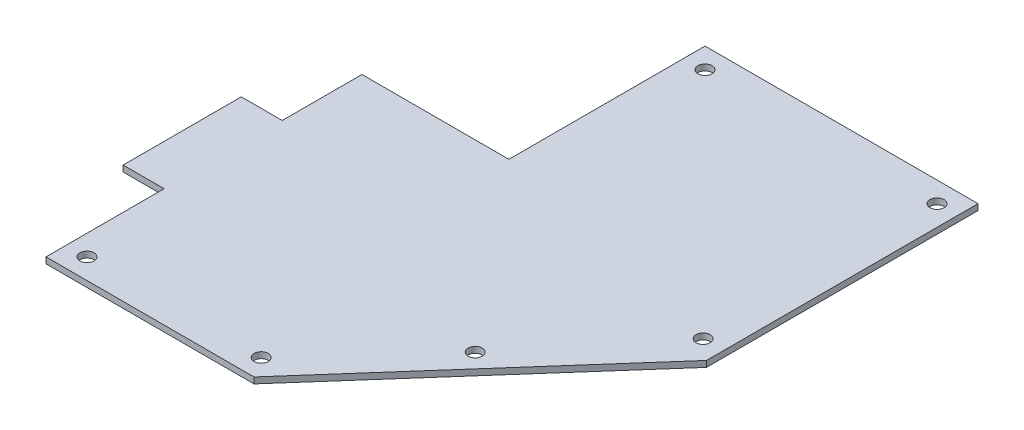
ISO-10303-21;
HEADER;
FILE_DESCRIPTION(('STEP AP214'),'2;1');
FILE_NAME('part.step','',(''),(''),'','','');
FILE_SCHEMA(('AUTOMOTIVE_DESIGN { 1 0 10303 214 1 1 1 1 }'));
ENDSEC;
DATA;
#1=APPLICATION_CONTEXT('core data for automotive mechanical design processes');
#2=APPLICATION_PROTOCOL_DEFINITION('international standard','automotive_design',2000,#1);
#3=PRODUCT_CONTEXT('',#1,'mechanical');
#4=PRODUCT('Part','Part','',(#3));
#5=PRODUCT_RELATED_PRODUCT_CATEGORY('part','',(#4));
#6=PRODUCT_DEFINITION_FORMATION('','',#4);
#7=PRODUCT_DEFINITION_CONTEXT('part definition',#1,'design');
#8=PRODUCT_DEFINITION('design','',#6,#7);
#9=PRODUCT_DEFINITION_SHAPE('','',#8);
#10=(LENGTH_UNIT() NAMED_UNIT(*) SI_UNIT(.MILLI.,.METRE.));
#11=(NAMED_UNIT(*) PLANE_ANGLE_UNIT() SI_UNIT($,.RADIAN.));
#12=(NAMED_UNIT(*) SI_UNIT($,.STERADIAN.) SOLID_ANGLE_UNIT());
#13=UNCERTAINTY_MEASURE_WITH_UNIT(LENGTH_MEASURE(1.E-05),#10,'distance_accuracy_value','');
#14=(GEOMETRIC_REPRESENTATION_CONTEXT(3) GLOBAL_UNCERTAINTY_ASSIGNED_CONTEXT((#13)) GLOBAL_UNIT_ASSIGNED_CONTEXT((#10,
#11,#12)) REPRESENTATION_CONTEXT('',''));
#15=CARTESIAN_POINT('',(0.,0.,0.));
#16=DIRECTION('',(0.,0.,1.));
#17=DIRECTION('',(1.,0.,0.));
#18=AXIS2_PLACEMENT_3D('',#15,#16,#17);
#19=CARTESIAN_POINT('',(0.,1.5,0.));
#20=DIRECTION('',(-1.,0.,0.));
#21=DIRECTION('',(0.,0.,1.));
#22=AXIS2_PLACEMENT_3D('',#19,#20,#21);
#23=PLANE('',#22);
#24=DIRECTION('',(0.,0.,-1.));
#25=VECTOR('',#24,1.);
#26=CARTESIAN_POINT('',(0.,0.,0.));
#27=LINE('',#26,#25);
#28=CARTESIAN_POINT('',(0.,0.,67.34));
#29=VERTEX_POINT('',#28);
#30=CARTESIAN_POINT('',(0.,0.,0.));
#31=VERTEX_POINT('',#30);
#32=EDGE_CURVE('E150',#29,#31,#27,.T.);
#33=ORIENTED_EDGE('',*,*,#32,.T.);
#34=DIRECTION('',(0.,-1.,0.));
#35=VECTOR('',#34,1.);
#36=CARTESIAN_POINT('',(0.,1.5,0.));
#37=LINE('',#36,#35);
#38=CARTESIAN_POINT('',(0.,1.5,0.));
#39=VERTEX_POINT('',#38);
#40=EDGE_CURVE('E11',#39,#31,#37,.T.);
#41=ORIENTED_EDGE('',*,*,#40,.F.);
#42=DIRECTION('',(0.,0.,-1.));
#43=VECTOR('',#42,1.);
#44=CARTESIAN_POINT('',(0.,1.5,0.));
#45=LINE('',#44,#43);
#46=CARTESIAN_POINT('',(0.,1.5,67.34));
#47=VERTEX_POINT('',#46);
#48=EDGE_CURVE('E171',#47,#39,#45,.T.);
#49=ORIENTED_EDGE('',*,*,#48,.F.);
#50=DIRECTION('',(0.,-1.,0.));
#51=VECTOR('',#50,1.);
#52=CARTESIAN_POINT('',(0.,1.5,67.34));
#53=LINE('',#52,#51);
#54=EDGE_CURVE('E146',#47,#29,#53,.T.);
#55=ORIENTED_EDGE('',*,*,#54,.T.);
#56=EDGE_LOOP('',(#33,#41,#49,#55));
#57=FACE_BOUND('',#56,.T.);
#58=ADVANCED_FACE('F36',(#57),#23,.F.);
#59=CARTESIAN_POINT('',(0.,1.5,0.));
#60=DIRECTION('',(0.,0.,1.));
#61=DIRECTION('',(1.,0.,0.));
#62=AXIS2_PLACEMENT_3D('',#59,#60,#61);
#63=PLANE('',#62);
#64=DIRECTION('',(-1.,0.,0.));
#65=VECTOR('',#64,1.);
#66=CARTESIAN_POINT('',(0.,0.,0.));
#67=LINE('',#66,#65);
#68=CARTESIAN_POINT('',(-67.7,0.,0.));
#69=VERTEX_POINT('',#68);
#70=EDGE_CURVE('E153',#31,#69,#67,.T.);
#71=ORIENTED_EDGE('',*,*,#70,.T.);
#72=DIRECTION('',(0.,-1.,0.));
#73=VECTOR('',#72,1.);
#74=CARTESIAN_POINT('',(-67.7,1.5,0.));
#75=LINE('',#74,#73);
#76=CARTESIAN_POINT('',(-67.7,1.5,0.));
#77=VERTEX_POINT('',#76);
#78=EDGE_CURVE('E44',#77,#69,#75,.T.);
#79=ORIENTED_EDGE('',*,*,#78,.F.);
#80=DIRECTION('',(-1.,0.,0.));
#81=VECTOR('',#80,1.);
#82=CARTESIAN_POINT('',(0.,1.5,0.));
#83=LINE('',#82,#81);
#84=EDGE_CURVE('E104',#39,#77,#83,.T.);
#85=ORIENTED_EDGE('',*,*,#84,.F.);
#86=ORIENTED_EDGE('',*,*,#40,.T.);
#87=EDGE_LOOP('',(#71,#79,#85,#86));
#88=FACE_BOUND('',#87,.T.);
#89=ADVANCED_FACE('F244',(#88),#63,.F.);
#90=CARTESIAN_POINT('',(-67.7,1.5,0.));
#91=DIRECTION('',(1.,0.,0.));
#92=DIRECTION('',(0.,0.,-1.));
#93=AXIS2_PLACEMENT_3D('',#90,#91,#92);
#94=PLANE('',#93);
#95=DIRECTION('',(0.,0.,1.));
#96=VECTOR('',#95,1.);
#97=CARTESIAN_POINT('',(-67.7,0.,0.));
#98=LINE('',#97,#96);
#99=CARTESIAN_POINT('',(-67.7,0.,48.64));
#100=VERTEX_POINT('',#99);
#101=EDGE_CURVE('E156',#69,#100,#98,.T.);
#102=ORIENTED_EDGE('',*,*,#101,.T.);
#103=DIRECTION('',(0.,-1.,0.));
#104=VECTOR('',#103,1.);
#105=CARTESIAN_POINT('',(-67.7,1.5,48.64));
#106=LINE('',#105,#104);
#107=CARTESIAN_POINT('',(-67.7,1.5,48.64));
#108=VERTEX_POINT('',#107);
#109=EDGE_CURVE('E187',#108,#100,#106,.T.);
#110=ORIENTED_EDGE('',*,*,#109,.F.);
#111=DIRECTION('',(0.,0.,1.));
#112=VECTOR('',#111,1.);
#113=CARTESIAN_POINT('',(-67.7,1.5,0.));
#114=LINE('',#113,#112);
#115=EDGE_CURVE('E195',#77,#108,#114,.T.);
#116=ORIENTED_EDGE('',*,*,#115,.F.);
#117=ORIENTED_EDGE('',*,*,#78,.T.);
#118=EDGE_LOOP('',(#102,#110,#116,#117));
#119=FACE_BOUND('',#118,.T.);
#120=ADVANCED_FACE('F193',(#119),#94,.F.);
#121=CARTESIAN_POINT('',(-67.7,1.5,48.64));
#122=DIRECTION('',(0.,0.,1.));
#123=DIRECTION('',(1.,0.,0.));
#124=AXIS2_PLACEMENT_3D('',#121,#122,#123);
#125=PLANE('',#124);
#126=DIRECTION('',(-1.,0.,0.));
#127=VECTOR('',#126,1.);
#128=CARTESIAN_POINT('',(-67.7,0.,48.64));
#129=LINE('',#128,#127);
#130=CARTESIAN_POINT('',(-104.14,0.,48.64));
#131=VERTEX_POINT('',#130);
#132=EDGE_CURVE('E158',#100,#131,#129,.T.);
#133=ORIENTED_EDGE('',*,*,#132,.T.);
#134=DIRECTION('',(0.,-1.,0.));
#135=VECTOR('',#134,1.);
#136=CARTESIAN_POINT('',(-104.14,1.5,48.64));
#137=LINE('',#136,#135);
#138=CARTESIAN_POINT('',(-104.14,1.5,48.64));
#139=VERTEX_POINT('',#138);
#140=EDGE_CURVE('E184',#139,#131,#137,.T.);
#141=ORIENTED_EDGE('',*,*,#140,.F.);
#142=DIRECTION('',(-1.,0.,0.));
#143=VECTOR('',#142,1.);
#144=CARTESIAN_POINT('',(-67.7,1.5,48.64));
#145=LINE('',#144,#143);
#146=EDGE_CURVE('E213',#108,#139,#145,.T.);
#147=ORIENTED_EDGE('',*,*,#146,.F.);
#148=ORIENTED_EDGE('',*,*,#109,.T.);
#149=EDGE_LOOP('',(#133,#141,#147,#148));
#150=FACE_BOUND('',#149,.T.);
#151=ADVANCED_FACE('F204',(#150),#125,.F.);
#152=CARTESIAN_POINT('',(-104.14,1.5,48.64));
#153=DIRECTION('',(1.,0.,0.));
#154=DIRECTION('',(0.,0.,-1.));
#155=AXIS2_PLACEMENT_3D('',#152,#153,#154);
#156=PLANE('',#155);
#157=DIRECTION('',(0.,0.,1.));
#158=VECTOR('',#157,1.);
#159=CARTESIAN_POINT('',(-104.14,0.,48.64));
#160=LINE('',#159,#158);
#161=CARTESIAN_POINT('',(-104.14,0.,68.4096817113205));
#162=VERTEX_POINT('',#161);
#163=EDGE_CURVE('E160',#131,#162,#160,.T.);
#164=ORIENTED_EDGE('',*,*,#163,.T.);
#165=DIRECTION('',(0.,-1.,0.));
#166=VECTOR('',#165,1.);
#167=CARTESIAN_POINT('',(-104.14,1.5,68.4096817113205));
#168=LINE('',#167,#166);
#169=CARTESIAN_POINT('',(-104.14,1.5,68.4096817113205));
#170=VERTEX_POINT('',#169);
#171=EDGE_CURVE('E181',#170,#162,#168,.T.);
#172=ORIENTED_EDGE('',*,*,#171,.F.);
#173=DIRECTION('',(0.,0.,1.));
#174=VECTOR('',#173,1.);
#175=CARTESIAN_POINT('',(-104.14,1.5,48.64));
#176=LINE('',#175,#174);
#177=EDGE_CURVE('E210',#139,#170,#176,.T.);
#178=ORIENTED_EDGE('',*,*,#177,.F.);
#179=ORIENTED_EDGE('',*,*,#140,.T.);
#180=EDGE_LOOP('',(#164,#172,#178,#179));
#181=FACE_BOUND('',#180,.T.);
#182=ADVANCED_FACE('F208',(#181),#156,.F.);
#183=CARTESIAN_POINT('',(-104.14,1.5,68.4096817113205));
#184=DIRECTION('',(0.,0.,1.));
#185=DIRECTION('',(1.,0.,0.));
#186=AXIS2_PLACEMENT_3D('',#183,#184,#185);
#187=PLANE('',#186);
#188=DIRECTION('',(-1.,0.,0.));
#189=VECTOR('',#188,1.);
#190=CARTESIAN_POINT('',(-104.14,0.,68.4096817113205));
#191=LINE('',#190,#189);
#192=CARTESIAN_POINT('',(-114.3,0.,68.4096817113205));
#193=VERTEX_POINT('',#192);
#194=EDGE_CURVE('E162',#162,#193,#191,.T.);
#195=ORIENTED_EDGE('',*,*,#194,.T.);
#196=DIRECTION('',(0.,-1.,0.));
#197=VECTOR('',#196,1.);
#198=CARTESIAN_POINT('',(-114.3,1.5,68.4096817113205));
#199=LINE('',#198,#197);
#200=CARTESIAN_POINT('',(-114.3,1.5,68.4096817113205));
#201=VERTEX_POINT('',#200);
#202=EDGE_CURVE('E178',#201,#193,#199,.T.);
#203=ORIENTED_EDGE('',*,*,#202,.F.);
#204=DIRECTION('',(-1.,0.,0.));
#205=VECTOR('',#204,1.);
#206=CARTESIAN_POINT('',(-104.14,1.5,68.4096817113205));
#207=LINE('',#206,#205);
#208=EDGE_CURVE('E212',#170,#201,#207,.T.);
#209=ORIENTED_EDGE('',*,*,#208,.F.);
#210=ORIENTED_EDGE('',*,*,#171,.T.);
#211=EDGE_LOOP('',(#195,#203,#209,#210));
#212=FACE_BOUND('',#211,.T.);
#213=ADVANCED_FACE('F257',(#212),#187,.F.);
#214=CARTESIAN_POINT('',(-114.3,1.5,68.4096817113205));
#215=DIRECTION('',(0.999999999995846,0.,2.88248870117891E-06));
#216=DIRECTION('',(2.88248870117891E-06,0.,-0.999999999995846));
#217=AXIS2_PLACEMENT_3D('',#214,#215,#216);
#218=PLANE('',#217);
#219=DIRECTION('',(-2.88248870117891E-06,0.,0.999999999995846));
#220=VECTOR('',#219,1.);
#221=CARTESIAN_POINT('',(-114.3,0.,68.4096817113205));
#222=LINE('',#221,#220);
#223=CARTESIAN_POINT('',(-114.300084456919,0.,97.7096817111988));
#224=VERTEX_POINT('',#223);
#225=EDGE_CURVE('E164',#193,#224,#222,.T.);
#226=ORIENTED_EDGE('',*,*,#225,.T.);
#227=DIRECTION('',(0.,-1.,0.));
#228=VECTOR('',#227,1.);
#229=CARTESIAN_POINT('',(-114.300084456919,1.5,97.7096817111988));
#230=LINE('',#229,#228);
#231=CARTESIAN_POINT('',(-114.300084456919,1.5,97.7096817111988));
#232=VERTEX_POINT('',#231);
#233=EDGE_CURVE('E175',#232,#224,#230,.T.);
#234=ORIENTED_EDGE('',*,*,#233,.F.);
#235=DIRECTION('',(-2.88248870117891E-06,0.,0.999999999995846));
#236=VECTOR('',#235,1.);
#237=CARTESIAN_POINT('',(-114.3,1.5,68.4096817113205));
#238=LINE('',#237,#236);
#239=EDGE_CURVE('E215',#201,#232,#238,.T.);
#240=ORIENTED_EDGE('',*,*,#239,.F.);
#241=ORIENTED_EDGE('',*,*,#202,.T.);
#242=EDGE_LOOP('',(#226,#234,#240,#241));
#243=FACE_BOUND('',#242,.T.);
#244=ADVANCED_FACE('F224',(#243),#218,.F.);
#245=CARTESIAN_POINT('',(-104.140084456919,1.5,97.7096817111988));
#246=DIRECTION('',(0.,0.,-1.));
#247=DIRECTION('',(-1.,0.,0.));
#248=AXIS2_PLACEMENT_3D('',#245,#246,#247);
#249=PLANE('',#248);
#250=DIRECTION('',(1.,0.,0.));
#251=VECTOR('',#250,1.);
#252=CARTESIAN_POINT('',(-104.140084456919,0.,97.7096817111988));
#253=LINE('',#252,#251);
#254=CARTESIAN_POINT('',(-104.140084456919,0.,97.7096817111988));
#255=VERTEX_POINT('',#254);
#256=EDGE_CURVE('E166',#224,#255,#253,.T.);
#257=ORIENTED_EDGE('',*,*,#256,.T.);
#258=DIRECTION('',(0.,-1.,0.));
#259=VECTOR('',#258,1.);
#260=CARTESIAN_POINT('',(-104.140084456919,1.5,97.7096817111988));
#261=LINE('',#260,#259);
#262=CARTESIAN_POINT('',(-104.140084456919,1.5,97.7096817111988));
#263=VERTEX_POINT('',#262);
#264=EDGE_CURVE('E141',#263,#255,#261,.T.);
#265=ORIENTED_EDGE('',*,*,#264,.F.);
#266=DIRECTION('',(1.,0.,0.));
#267=VECTOR('',#266,1.);
#268=CARTESIAN_POINT('',(-104.140084456919,1.5,97.7096817111988));
#269=LINE('',#268,#267);
#270=EDGE_CURVE('E132',#232,#263,#269,.T.);
#271=ORIENTED_EDGE('',*,*,#270,.F.);
#272=ORIENTED_EDGE('',*,*,#233,.T.);
#273=EDGE_LOOP('',(#257,#265,#271,#272));
#274=FACE_BOUND('',#273,.T.);
#275=ADVANCED_FACE('F228',(#274),#249,.F.);
#276=CARTESIAN_POINT('',(-104.140084456919,1.5,126.999681711199));
#277=DIRECTION('',(1.,0.,0.));
#278=DIRECTION('',(0.,0.,-1.));
#279=AXIS2_PLACEMENT_3D('',#276,#277,#278);
#280=PLANE('',#279);
#281=DIRECTION('',(0.,0.,1.));
#282=VECTOR('',#281,1.);
#283=CARTESIAN_POINT('',(-104.140084456919,0.,126.999681711199));
#284=LINE('',#283,#282);
#285=CARTESIAN_POINT('',(-104.140084456919,0.,126.999681711199));
#286=VERTEX_POINT('',#285);
#287=EDGE_CURVE('E140',#255,#286,#284,.T.);
#288=ORIENTED_EDGE('',*,*,#287,.T.);
#289=DIRECTION('',(0.,-1.,0.));
#290=VECTOR('',#289,1.);
#291=CARTESIAN_POINT('',(-104.140084456919,1.5,126.999681711199));
#292=LINE('',#291,#290);
#293=CARTESIAN_POINT('',(-104.140084456919,1.5,126.999681711199));
#294=VERTEX_POINT('',#293);
#295=EDGE_CURVE('E137',#294,#286,#292,.T.);
#296=ORIENTED_EDGE('',*,*,#295,.F.);
#297=DIRECTION('',(0.,0.,1.));
#298=VECTOR('',#297,1.);
#299=CARTESIAN_POINT('',(-104.140084456919,1.5,126.999681711199));
#300=LINE('',#299,#298);
#301=EDGE_CURVE('E126',#263,#294,#300,.T.);
#302=ORIENTED_EDGE('',*,*,#301,.F.);
#303=ORIENTED_EDGE('',*,*,#264,.T.);
#304=EDGE_LOOP('',(#288,#296,#302,#303));
#305=FACE_BOUND('',#304,.T.);
#306=ADVANCED_FACE('F138',(#305),#280,.F.);
#307=CARTESIAN_POINT('',(-52.560084456919,1.5,126.999681711199));
#308=DIRECTION('',(0.,0.,-1.));
#309=DIRECTION('',(-1.,0.,0.));
#310=AXIS2_PLACEMENT_3D('',#307,#308,#309);
#311=PLANE('',#310);
#312=DIRECTION('',(1.,0.,0.));
#313=VECTOR('',#312,1.);
#314=CARTESIAN_POINT('',(-52.560084456919,0.,126.999681711199));
#315=LINE('',#314,#313);
#316=CARTESIAN_POINT('',(-52.560084456919,0.,126.999681711199));
#317=VERTEX_POINT('',#316);
#318=EDGE_CURVE('E90',#286,#317,#315,.T.);
#319=ORIENTED_EDGE('',*,*,#318,.T.);
#320=DIRECTION('',(0.,-1.,0.));
#321=VECTOR('',#320,1.);
#322=CARTESIAN_POINT('',(-52.560084456919,1.5,126.999681711199));
#323=LINE('',#322,#321);
#324=CARTESIAN_POINT('',(-52.560084456919,1.5,126.999681711199));
#325=VERTEX_POINT('',#324);
#326=EDGE_CURVE('E142',#325,#317,#323,.T.);
#327=ORIENTED_EDGE('',*,*,#326,.F.);
#328=DIRECTION('',(1.,0.,0.));
#329=VECTOR('',#328,1.);
#330=CARTESIAN_POINT('',(-52.560084456919,1.5,126.999681711199));
#331=LINE('',#330,#329);
#332=EDGE_CURVE('E130',#294,#325,#331,.T.);
#333=ORIENTED_EDGE('',*,*,#332,.F.);
#334=ORIENTED_EDGE('',*,*,#295,.T.);
#335=EDGE_LOOP('',(#319,#327,#333,#334));
#336=FACE_BOUND('',#335,.T.);
#337=ADVANCED_FACE('F144',(#336),#311,.F.);
#338=CARTESIAN_POINT('',(0.,1.5,67.34));
#339=DIRECTION('',(-0.750341865315039,0.,-0.661049986881134));
#340=DIRECTION('',(-0.661049986881134,0.,0.75034186531504));
#341=AXIS2_PLACEMENT_3D('',#338,#339,#340);
#342=PLANE('',#341);
#343=DIRECTION('',(0.661049986881134,0.,-0.750341865315039));
#344=VECTOR('',#343,1.);
#345=CARTESIAN_POINT('',(0.,0.,67.34));
#346=LINE('',#345,#344);
#347=EDGE_CURVE('E96',#317,#29,#346,.T.);
#348=ORIENTED_EDGE('',*,*,#347,.T.);
#349=ORIENTED_EDGE('',*,*,#54,.F.);
#350=DIRECTION('',(0.661049986881134,0.,-0.750341865315039));
#351=VECTOR('',#350,1.);
#352=CARTESIAN_POINT('',(0.,1.5,67.34));
#353=LINE('',#352,#351);
#354=EDGE_CURVE('E52',#325,#47,#353,.T.);
#355=ORIENTED_EDGE('',*,*,#354,.F.);
#356=ORIENTED_EDGE('',*,*,#326,.T.);
#357=EDGE_LOOP('',(#348,#349,#355,#356));
#358=FACE_BOUND('',#357,.T.);
#359=ADVANCED_FACE('F232',(#358),#342,.F.);
#360=CARTESIAN_POINT('',(0.,1.5,0.));
#361=DIRECTION('',(0.,-1.,0.));
#362=DIRECTION('',(0.,0.,-1.));
#363=AXIS2_PLACEMENT_3D('',#360,#361,#362);
#364=PLANE('',#363);
#365=CARTESIAN_POINT('',(-99.0600844569189,1.5,121.919681711199));
#366=DIRECTION('',(0.,1.,0.));
#367=DIRECTION('',(0.,0.,1.));
#368=AXIS2_PLACEMENT_3D('',#365,#366,#367);
#369=CIRCLE('',#368,1.75);
#370=CARTESIAN_POINT('',(-99.0600844569189,1.5,123.669681711199));
#371=VERTEX_POINT('',#370);
#372=EDGE_CURVE('E362',#371,#371,#369,.T.);
#373=ORIENTED_EDGE('',*,*,#372,.F.);
#374=EDGE_LOOP('',(#373));
#375=FACE_BOUND('',#374,.T.);
#376=CARTESIAN_POINT('',(-55.8500844569189,1.5,121.919681711199));
#377=DIRECTION('',(0.,1.,0.));
#378=DIRECTION('',(0.,0.,1.));
#379=AXIS2_PLACEMENT_3D('',#376,#377,#378);
#380=CIRCLE('',#379,1.75);
#381=CARTESIAN_POINT('',(-55.8500844569189,1.5,123.669681711199));
#382=VERTEX_POINT('',#381);
#383=EDGE_CURVE('E364',#382,#382,#380,.T.);
#384=ORIENTED_EDGE('',*,*,#383,.F.);
#385=EDGE_LOOP('',(#384));
#386=FACE_BOUND('',#385,.T.);
#387=CARTESIAN_POINT('',(-5.07999999999999,1.5,63.08));
#388=DIRECTION('',(0.,1.,0.));
#389=DIRECTION('',(0.,0.,1.));
#390=AXIS2_PLACEMENT_3D('',#387,#388,#389);
#391=CIRCLE('',#390,1.75);
#392=CARTESIAN_POINT('',(-5.07999999999999,1.5,64.83));
#393=VERTEX_POINT('',#392);
#394=EDGE_CURVE('E372',#393,#393,#391,.T.);
#395=ORIENTED_EDGE('',*,*,#394,.F.);
#396=EDGE_LOOP('',(#395));
#397=FACE_BOUND('',#396,.T.);
#398=CARTESIAN_POINT('',(-30.4665028022066,1.5,94.2370469633044));
#399=DIRECTION('',(0.,1.,0.));
#400=DIRECTION('',(0.,0.,1.));
#401=AXIS2_PLACEMENT_3D('',#398,#399,#400);
#402=CIRCLE('',#401,1.75);
#403=CARTESIAN_POINT('',(-30.4665028022066,1.5,95.9870469633044));
#404=VERTEX_POINT('',#403);
#405=EDGE_CURVE('E378',#404,#404,#402,.T.);
#406=ORIENTED_EDGE('',*,*,#405,.F.);
#407=EDGE_LOOP('',(#406));
#408=FACE_BOUND('',#407,.T.);
#409=CARTESIAN_POINT('',(-5.07999999999999,1.5,5.08));
#410=DIRECTION('',(0.,1.,0.));
#411=DIRECTION('',(0.,0.,1.));
#412=AXIS2_PLACEMENT_3D('',#409,#410,#411);
#413=CIRCLE('',#412,1.75);
#414=CARTESIAN_POINT('',(-5.07999999999999,1.5,6.83));
#415=VERTEX_POINT('',#414);
#416=EDGE_CURVE('E384',#415,#415,#413,.T.);
#417=ORIENTED_EDGE('',*,*,#416,.F.);
#418=EDGE_LOOP('',(#417));
#419=FACE_BOUND('',#418,.T.);
#420=CARTESIAN_POINT('',(-62.62,1.5,5.08));
#421=DIRECTION('',(0.,1.,0.));
#422=DIRECTION('',(0.,0.,1.));
#423=AXIS2_PLACEMENT_3D('',#420,#421,#422);
#424=CIRCLE('',#423,1.75);
#425=CARTESIAN_POINT('',(-62.62,1.5,6.83));
#426=VERTEX_POINT('',#425);
#427=EDGE_CURVE('E390',#426,#426,#424,.T.);
#428=ORIENTED_EDGE('',*,*,#427,.F.);
#429=EDGE_LOOP('',(#428));
#430=FACE_BOUND('',#429,.T.);
#431=ORIENTED_EDGE('',*,*,#48,.T.);
#432=ORIENTED_EDGE('',*,*,#84,.T.);
#433=ORIENTED_EDGE('',*,*,#115,.T.);
#434=ORIENTED_EDGE('',*,*,#146,.T.);
#435=ORIENTED_EDGE('',*,*,#177,.T.);
#436=ORIENTED_EDGE('',*,*,#208,.T.);
#437=ORIENTED_EDGE('',*,*,#239,.T.);
#438=ORIENTED_EDGE('',*,*,#270,.T.);
#439=ORIENTED_EDGE('',*,*,#301,.T.);
#440=ORIENTED_EDGE('',*,*,#332,.T.);
#441=ORIENTED_EDGE('',*,*,#354,.T.);
#442=EDGE_LOOP('',(#431,#432,#433,#434,#435,#436,#437,#438,#439,#440,#441));
#443=FACE_BOUND('',#442,.T.);
#444=ADVANCED_FACE('F128',(#375,#386,#397,#408,#419,#430,#443),#364,.F.);
#445=CARTESIAN_POINT('',(0.,0.,0.));
#446=DIRECTION('',(0.,-1.,0.));
#447=DIRECTION('',(0.,0.,-1.));
#448=AXIS2_PLACEMENT_3D('',#445,#446,#447);
#449=PLANE('',#448);
#450=CARTESIAN_POINT('',(-99.0600844569189,0.,121.919681711199));
#451=DIRECTION('',(0.,1.,0.));
#452=DIRECTION('',(0.,0.,1.));
#453=AXIS2_PLACEMENT_3D('',#450,#451,#452);
#454=CIRCLE('',#453,1.75);
#455=CARTESIAN_POINT('',(-99.0600844569189,0.,123.669681711199));
#456=VERTEX_POINT('',#455);
#457=EDGE_CURVE('E359',#456,#456,#454,.T.);
#458=ORIENTED_EDGE('',*,*,#457,.T.);
#459=EDGE_LOOP('',(#458));
#460=FACE_BOUND('',#459,.T.);
#461=CARTESIAN_POINT('',(-55.8500844569189,0.,121.919681711199));
#462=DIRECTION('',(0.,1.,0.));
#463=DIRECTION('',(0.,0.,1.));
#464=AXIS2_PLACEMENT_3D('',#461,#462,#463);
#465=CIRCLE('',#464,1.75);
#466=CARTESIAN_POINT('',(-55.8500844569189,0.,123.669681711199));
#467=VERTEX_POINT('',#466);
#468=EDGE_CURVE('E369',#467,#467,#465,.T.);
#469=ORIENTED_EDGE('',*,*,#468,.T.);
#470=EDGE_LOOP('',(#469));
#471=FACE_BOUND('',#470,.T.);
#472=CARTESIAN_POINT('',(-5.07999999999999,0.,63.08));
#473=DIRECTION('',(0.,1.,0.));
#474=DIRECTION('',(0.,0.,1.));
#475=AXIS2_PLACEMENT_3D('',#472,#473,#474);
#476=CIRCLE('',#475,1.75);
#477=CARTESIAN_POINT('',(-5.07999999999999,0.,64.83));
#478=VERTEX_POINT('',#477);
#479=EDGE_CURVE('E375',#478,#478,#476,.T.);
#480=ORIENTED_EDGE('',*,*,#479,.T.);
#481=EDGE_LOOP('',(#480));
#482=FACE_BOUND('',#481,.T.);
#483=CARTESIAN_POINT('',(-30.4665028022066,0.,94.2370469633044));
#484=DIRECTION('',(0.,1.,0.));
#485=DIRECTION('',(0.,0.,1.));
#486=AXIS2_PLACEMENT_3D('',#483,#484,#485);
#487=CIRCLE('',#486,1.75);
#488=CARTESIAN_POINT('',(-30.4665028022066,0.,95.9870469633044));
#489=VERTEX_POINT('',#488);
#490=EDGE_CURVE('E381',#489,#489,#487,.T.);
#491=ORIENTED_EDGE('',*,*,#490,.T.);
#492=EDGE_LOOP('',(#491));
#493=FACE_BOUND('',#492,.T.);
#494=CARTESIAN_POINT('',(-5.07999999999999,0.,5.08));
#495=DIRECTION('',(0.,1.,0.));
#496=DIRECTION('',(0.,0.,1.));
#497=AXIS2_PLACEMENT_3D('',#494,#495,#496);
#498=CIRCLE('',#497,1.75);
#499=CARTESIAN_POINT('',(-5.07999999999999,0.,6.83));
#500=VERTEX_POINT('',#499);
#501=EDGE_CURVE('E387',#500,#500,#498,.T.);
#502=ORIENTED_EDGE('',*,*,#501,.T.);
#503=EDGE_LOOP('',(#502));
#504=FACE_BOUND('',#503,.T.);
#505=CARTESIAN_POINT('',(-62.62,0.,5.08));
#506=DIRECTION('',(0.,1.,0.));
#507=DIRECTION('',(0.,0.,1.));
#508=AXIS2_PLACEMENT_3D('',#505,#506,#507);
#509=CIRCLE('',#508,1.75);
#510=CARTESIAN_POINT('',(-62.62,0.,6.83));
#511=VERTEX_POINT('',#510);
#512=EDGE_CURVE('E154',#511,#511,#509,.T.);
#513=ORIENTED_EDGE('',*,*,#512,.T.);
#514=EDGE_LOOP('',(#513));
#515=FACE_BOUND('',#514,.T.);
#516=ORIENTED_EDGE('',*,*,#32,.F.);
#517=ORIENTED_EDGE('',*,*,#347,.F.);
#518=ORIENTED_EDGE('',*,*,#318,.F.);
#519=ORIENTED_EDGE('',*,*,#287,.F.);
#520=ORIENTED_EDGE('',*,*,#256,.F.);
#521=ORIENTED_EDGE('',*,*,#225,.F.);
#522=ORIENTED_EDGE('',*,*,#194,.F.);
#523=ORIENTED_EDGE('',*,*,#163,.F.);
#524=ORIENTED_EDGE('',*,*,#132,.F.);
#525=ORIENTED_EDGE('',*,*,#101,.F.);
#526=ORIENTED_EDGE('',*,*,#70,.F.);
#527=EDGE_LOOP('',(#516,#517,#518,#519,#520,#521,#522,#523,#524,#525,#526));
#528=FACE_BOUND('',#527,.T.);
#529=ADVANCED_FACE('F199',(#460,#471,#482,#493,#504,#515,#528),#449,.T.);
#530=CARTESIAN_POINT('',(-62.62,1.5,5.08));
#531=DIRECTION('',(0.,1.,0.));
#532=DIRECTION('',(0.,0.,1.));
#533=AXIS2_PLACEMENT_3D('',#530,#531,#532);
#534=CYLINDRICAL_SURFACE('',#533,1.75);
#535=ORIENTED_EDGE('',*,*,#512,.F.);
#536=EDGE_LOOP('',(#535));
#537=FACE_BOUND('',#536,.T.);
#538=ORIENTED_EDGE('',*,*,#427,.T.);
#539=EDGE_LOOP('',(#538));
#540=FACE_BOUND('',#539,.T.);
#541=ADVANCED_FACE('F293',(#537,#540),#534,.F.);
#542=CARTESIAN_POINT('',(-5.07999999999999,1.5,5.08));
#543=DIRECTION('',(0.,1.,0.));
#544=DIRECTION('',(0.,0.,1.));
#545=AXIS2_PLACEMENT_3D('',#542,#543,#544);
#546=CYLINDRICAL_SURFACE('',#545,1.75);
#547=ORIENTED_EDGE('',*,*,#501,.F.);
#548=EDGE_LOOP('',(#547));
#549=FACE_BOUND('',#548,.T.);
#550=ORIENTED_EDGE('',*,*,#416,.T.);
#551=EDGE_LOOP('',(#550));
#552=FACE_BOUND('',#551,.T.);
#553=ADVANCED_FACE('F302',(#549,#552),#546,.F.);
#554=CARTESIAN_POINT('',(-30.4665028022066,1.5,94.2370469633044));
#555=DIRECTION('',(0.,1.,0.));
#556=DIRECTION('',(0.,0.,1.));
#557=AXIS2_PLACEMENT_3D('',#554,#555,#556);
#558=CYLINDRICAL_SURFACE('',#557,1.75);
#559=ORIENTED_EDGE('',*,*,#490,.F.);
#560=EDGE_LOOP('',(#559));
#561=FACE_BOUND('',#560,.T.);
#562=ORIENTED_EDGE('',*,*,#405,.T.);
#563=EDGE_LOOP('',(#562));
#564=FACE_BOUND('',#563,.T.);
#565=ADVANCED_FACE('F312',(#561,#564),#558,.F.);
#566=CARTESIAN_POINT('',(-5.07999999999999,1.5,63.08));
#567=DIRECTION('',(0.,1.,0.));
#568=DIRECTION('',(0.,0.,1.));
#569=AXIS2_PLACEMENT_3D('',#566,#567,#568);
#570=CYLINDRICAL_SURFACE('',#569,1.75);
#571=ORIENTED_EDGE('',*,*,#479,.F.);
#572=EDGE_LOOP('',(#571));
#573=FACE_BOUND('',#572,.T.);
#574=ORIENTED_EDGE('',*,*,#394,.T.);
#575=EDGE_LOOP('',(#574));
#576=FACE_BOUND('',#575,.T.);
#577=ADVANCED_FACE('F322',(#573,#576),#570,.F.);
#578=CARTESIAN_POINT('',(-55.8500844569189,1.5,121.919681711199));
#579=DIRECTION('',(0.,1.,0.));
#580=DIRECTION('',(0.,0.,1.));
#581=AXIS2_PLACEMENT_3D('',#578,#579,#580);
#582=CYLINDRICAL_SURFACE('',#581,1.75);
#583=ORIENTED_EDGE('',*,*,#468,.F.);
#584=EDGE_LOOP('',(#583));
#585=FACE_BOUND('',#584,.T.);
#586=ORIENTED_EDGE('',*,*,#383,.T.);
#587=EDGE_LOOP('',(#586));
#588=FACE_BOUND('',#587,.T.);
#589=ADVANCED_FACE('F332',(#585,#588),#582,.F.);
#590=CARTESIAN_POINT('',(-99.0600844569189,1.5,121.919681711199));
#591=DIRECTION('',(0.,1.,0.));
#592=DIRECTION('',(0.,0.,1.));
#593=AXIS2_PLACEMENT_3D('',#590,#591,#592);
#594=CYLINDRICAL_SURFACE('',#593,1.75);
#595=ORIENTED_EDGE('',*,*,#457,.F.);
#596=EDGE_LOOP('',(#595));
#597=FACE_BOUND('',#596,.T.);
#598=ORIENTED_EDGE('',*,*,#372,.T.);
#599=EDGE_LOOP('',(#598));
#600=FACE_BOUND('',#599,.T.);
#601=ADVANCED_FACE('F342',(#597,#600),#594,.F.);
#602=CLOSED_SHELL('',(#58,#89,#120,#151,#182,#213,#244,#275,#306,#337,#359,#444,#529,#541,#553,
#565,#577,#589,#601));
#603=MANIFOLD_SOLID_BREP('B2',#602);
#604=ADVANCED_BREP_SHAPE_REPRESENTATION('',(#18,#603),#14);
#605=SHAPE_DEFINITION_REPRESENTATION(#9,#604);
ENDSEC;
END-ISO-10303-21;
